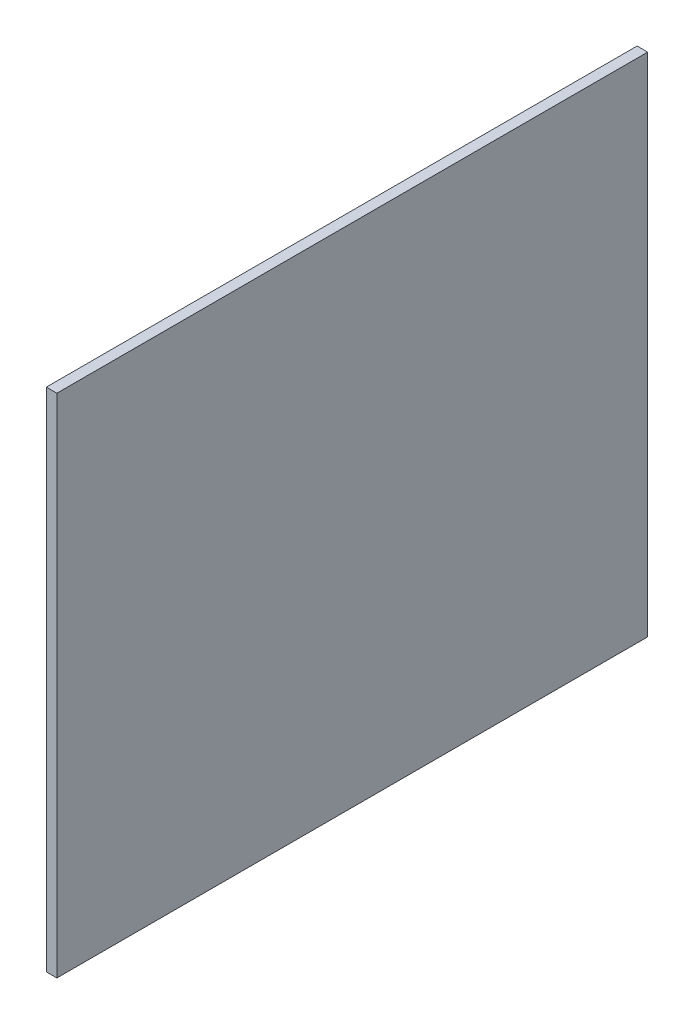
ISO-10303-21;
HEADER;
FILE_DESCRIPTION(('STEP AP214'),'2;1');
FILE_NAME('part.step','',(''),(''),'','','');
FILE_SCHEMA(('AUTOMOTIVE_DESIGN { 1 0 10303 214 1 1 1 1 }'));
ENDSEC;
DATA;
#1=APPLICATION_CONTEXT('core data for automotive mechanical design processes');
#2=APPLICATION_PROTOCOL_DEFINITION('international standard','automotive_design',2000,#1);
#3=PRODUCT_CONTEXT('',#1,'mechanical');
#4=PRODUCT('Part','Part','',(#3));
#5=PRODUCT_RELATED_PRODUCT_CATEGORY('part','',(#4));
#6=PRODUCT_DEFINITION_FORMATION('','',#4);
#7=PRODUCT_DEFINITION_CONTEXT('part definition',#1,'design');
#8=PRODUCT_DEFINITION('design','',#6,#7);
#9=PRODUCT_DEFINITION_SHAPE('','',#8);
#10=(LENGTH_UNIT() NAMED_UNIT(*) SI_UNIT(.MILLI.,.METRE.));
#11=(NAMED_UNIT(*) PLANE_ANGLE_UNIT() SI_UNIT($,.RADIAN.));
#12=(NAMED_UNIT(*) SI_UNIT($,.STERADIAN.) SOLID_ANGLE_UNIT());
#13=UNCERTAINTY_MEASURE_WITH_UNIT(LENGTH_MEASURE(1.E-05),#10,'distance_accuracy_value','');
#14=(GEOMETRIC_REPRESENTATION_CONTEXT(3) GLOBAL_UNCERTAINTY_ASSIGNED_CONTEXT((#13)) GLOBAL_UNIT_ASSIGNED_CONTEXT((#10,
#11,#12)) REPRESENTATION_CONTEXT('',''));
#15=CARTESIAN_POINT('',(0.,0.,0.));
#16=DIRECTION('',(0.,0.,1.));
#17=DIRECTION('',(1.,0.,0.));
#18=AXIS2_PLACEMENT_3D('',#15,#16,#17);
#19=CARTESIAN_POINT('',(0.,-609.6,0.));
#20=DIRECTION('',(1.,0.,0.));
#21=DIRECTION('',(0.,0.,-1.));
#22=AXIS2_PLACEMENT_3D('',#19,#20,#21);
#23=PLANE('',#22);
#24=DIRECTION('',(0.,0.,-1.));
#25=VECTOR('',#24,1.);
#26=CARTESIAN_POINT('',(0.,0.,0.));
#27=LINE('',#26,#25);
#28=CARTESIAN_POINT('',(0.,0.,711.2));
#29=VERTEX_POINT('',#28);
#30=CARTESIAN_POINT('',(0.,0.,0.));
#31=VERTEX_POINT('',#30);
#32=EDGE_CURVE('E109',#29,#31,#27,.T.);
#33=ORIENTED_EDGE('',*,*,#32,.F.);
#34=DIRECTION('',(0.,1.,0.));
#35=VECTOR('',#34,1.);
#36=CARTESIAN_POINT('',(0.,-609.6,711.2));
#37=LINE('',#36,#35);
#38=CARTESIAN_POINT('',(0.,-609.6,711.2));
#39=VERTEX_POINT('',#38);
#40=EDGE_CURVE('E11',#39,#29,#37,.T.);
#41=ORIENTED_EDGE('',*,*,#40,.F.);
#42=DIRECTION('',(0.,0.,-1.));
#43=VECTOR('',#42,1.);
#44=CARTESIAN_POINT('',(0.,-609.6,0.));
#45=LINE('',#44,#43);
#46=CARTESIAN_POINT('',(0.,-609.6,0.));
#47=VERTEX_POINT('',#46);
#48=EDGE_CURVE('E101',#39,#47,#45,.T.);
#49=ORIENTED_EDGE('',*,*,#48,.T.);
#50=DIRECTION('',(0.,1.,0.));
#51=VECTOR('',#50,1.);
#52=CARTESIAN_POINT('',(0.,-609.6,0.));
#53=LINE('',#52,#51);
#54=EDGE_CURVE('E42',#47,#31,#53,.T.);
#55=ORIENTED_EDGE('',*,*,#54,.T.);
#56=EDGE_LOOP('',(#33,#41,#49,#55));
#57=FACE_BOUND('',#56,.T.);
#58=ADVANCED_FACE('F39',(#57),#23,.T.);
#59=CARTESIAN_POINT('',(0.,-609.6,711.2));
#60=DIRECTION('',(0.,0.,1.));
#61=DIRECTION('',(1.,0.,0.));
#62=AXIS2_PLACEMENT_3D('',#59,#60,#61);
#63=PLANE('',#62);
#64=DIRECTION('',(1.,0.,0.));
#65=VECTOR('',#64,1.);
#66=CARTESIAN_POINT('',(0.,0.,711.2));
#67=LINE('',#66,#65);
#68=CARTESIAN_POINT('',(-12.6999999999999,0.,711.2));
#69=VERTEX_POINT('',#68);
#70=EDGE_CURVE('E104',#69,#29,#67,.T.);
#71=ORIENTED_EDGE('',*,*,#70,.F.);
#72=DIRECTION('',(0.,1.,0.));
#73=VECTOR('',#72,1.);
#74=CARTESIAN_POINT('',(-12.6999999999999,-609.6,711.2));
#75=LINE('',#74,#73);
#76=CARTESIAN_POINT('',(-12.6999999999999,-609.6,711.2));
#77=VERTEX_POINT('',#76);
#78=EDGE_CURVE('E49',#77,#69,#75,.T.);
#79=ORIENTED_EDGE('',*,*,#78,.F.);
#80=DIRECTION('',(1.,0.,0.));
#81=VECTOR('',#80,1.);
#82=CARTESIAN_POINT('',(0.,-609.6,711.2));
#83=LINE('',#82,#81);
#84=EDGE_CURVE('E96',#77,#39,#83,.T.);
#85=ORIENTED_EDGE('',*,*,#84,.T.);
#86=ORIENTED_EDGE('',*,*,#40,.T.);
#87=EDGE_LOOP('',(#71,#79,#85,#86));
#88=FACE_BOUND('',#87,.T.);
#89=ADVANCED_FACE('F125',(#88),#63,.T.);
#90=CARTESIAN_POINT('',(-12.7,-609.6,0.));
#91=DIRECTION('',(-1.,0.,0.));
#92=DIRECTION('',(0.,0.,1.));
#93=AXIS2_PLACEMENT_3D('',#90,#91,#92);
#94=PLANE('',#93);
#95=DIRECTION('',(0.,0.,1.));
#96=VECTOR('',#95,1.);
#97=CARTESIAN_POINT('',(-12.7,0.,0.));
#98=LINE('',#97,#96);
#99=CARTESIAN_POINT('',(-12.7,0.,0.));
#100=VERTEX_POINT('',#99);
#101=EDGE_CURVE('E90',#100,#69,#98,.T.);
#102=ORIENTED_EDGE('',*,*,#101,.F.);
#103=DIRECTION('',(0.,1.,0.));
#104=VECTOR('',#103,1.);
#105=CARTESIAN_POINT('',(-12.7,-609.6,0.));
#106=LINE('',#105,#104);
#107=CARTESIAN_POINT('',(-12.7,-609.6,0.));
#108=VERTEX_POINT('',#107);
#109=EDGE_CURVE('E85',#108,#100,#106,.T.);
#110=ORIENTED_EDGE('',*,*,#109,.F.);
#111=DIRECTION('',(0.,0.,1.));
#112=VECTOR('',#111,1.);
#113=CARTESIAN_POINT('',(-12.7,-609.6,0.));
#114=LINE('',#113,#112);
#115=EDGE_CURVE('E88',#108,#77,#114,.T.);
#116=ORIENTED_EDGE('',*,*,#115,.T.);
#117=ORIENTED_EDGE('',*,*,#78,.T.);
#118=EDGE_LOOP('',(#102,#110,#116,#117));
#119=FACE_BOUND('',#118,.T.);
#120=ADVANCED_FACE('F87',(#119),#94,.T.);
#121=CARTESIAN_POINT('',(0.,-609.6,0.));
#122=DIRECTION('',(0.,0.,-1.));
#123=DIRECTION('',(-1.,0.,0.));
#124=AXIS2_PLACEMENT_3D('',#121,#122,#123);
#125=PLANE('',#124);
#126=DIRECTION('',(-1.,0.,0.));
#127=VECTOR('',#126,1.);
#128=CARTESIAN_POINT('',(0.,0.,0.));
#129=LINE('',#128,#127);
#130=EDGE_CURVE('E113',#31,#100,#129,.T.);
#131=ORIENTED_EDGE('',*,*,#130,.F.);
#132=ORIENTED_EDGE('',*,*,#54,.F.);
#133=DIRECTION('',(-1.,0.,0.));
#134=VECTOR('',#133,1.);
#135=CARTESIAN_POINT('',(0.,-609.6,0.));
#136=LINE('',#135,#134);
#137=EDGE_CURVE('E95',#47,#108,#136,.T.);
#138=ORIENTED_EDGE('',*,*,#137,.T.);
#139=ORIENTED_EDGE('',*,*,#109,.T.);
#140=EDGE_LOOP('',(#131,#132,#138,#139));
#141=FACE_BOUND('',#140,.T.);
#142=ADVANCED_FACE('F99',(#141),#125,.T.);
#143=CARTESIAN_POINT('',(0.,-609.6,0.));
#144=DIRECTION('',(0.,-1.,0.));
#145=DIRECTION('',(0.,0.,-1.));
#146=AXIS2_PLACEMENT_3D('',#143,#144,#145);
#147=PLANE('',#146);
#148=ORIENTED_EDGE('',*,*,#48,.F.);
#149=ORIENTED_EDGE('',*,*,#84,.F.);
#150=ORIENTED_EDGE('',*,*,#115,.F.);
#151=ORIENTED_EDGE('',*,*,#137,.F.);
#152=EDGE_LOOP('',(#148,#149,#150,#151));
#153=FACE_BOUND('',#152,.T.);
#154=ADVANCED_FACE('F94',(#153),#147,.T.);
#155=CARTESIAN_POINT('',(0.,0.,0.));
#156=DIRECTION('',(0.,-1.,0.));
#157=DIRECTION('',(0.,0.,-1.));
#158=AXIS2_PLACEMENT_3D('',#155,#156,#157);
#159=PLANE('',#158);
#160=ORIENTED_EDGE('',*,*,#32,.T.);
#161=ORIENTED_EDGE('',*,*,#130,.T.);
#162=ORIENTED_EDGE('',*,*,#101,.T.);
#163=ORIENTED_EDGE('',*,*,#70,.T.);
#164=EDGE_LOOP('',(#160,#161,#162,#163));
#165=FACE_BOUND('',#164,.T.);
#166=ADVANCED_FACE('F124',(#165),#159,.F.);
#167=CLOSED_SHELL('',(#58,#89,#120,#142,#154,#166));
#168=MANIFOLD_SOLID_BREP('B2',#167);
#169=ADVANCED_BREP_SHAPE_REPRESENTATION('',(#18,#168),#14);
#170=SHAPE_DEFINITION_REPRESENTATION(#9,#169);
ENDSEC;
END-ISO-10303-21;
